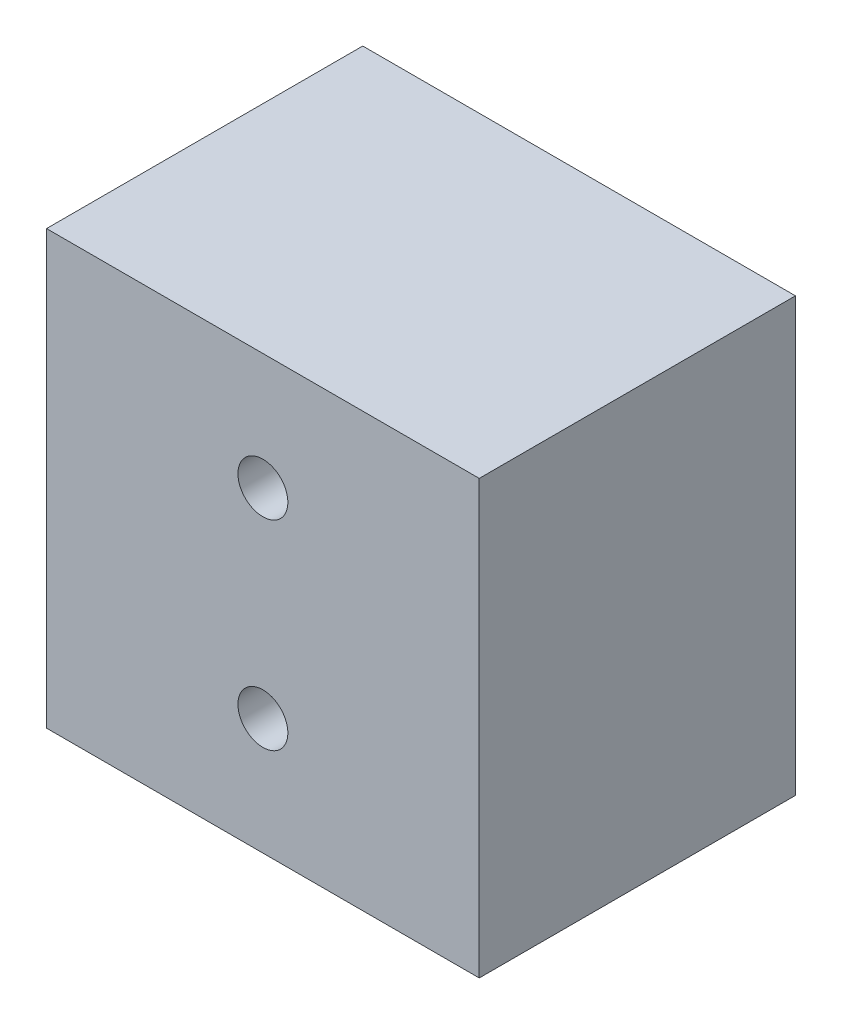
ISO-10303-21;
HEADER;
FILE_DESCRIPTION(('STEP AP214'),'2;1');
FILE_NAME('part.step','',(''),(''),'','','');
FILE_SCHEMA(('AUTOMOTIVE_DESIGN { 1 0 10303 214 1 1 1 1 }'));
ENDSEC;
DATA;
#1=APPLICATION_CONTEXT('core data for automotive mechanical design processes');
#2=APPLICATION_PROTOCOL_DEFINITION('international standard','automotive_design',2000,#1);
#3=PRODUCT_CONTEXT('',#1,'mechanical');
#4=PRODUCT('Part','Part','',(#3));
#5=PRODUCT_RELATED_PRODUCT_CATEGORY('part','',(#4));
#6=PRODUCT_DEFINITION_FORMATION('','',#4);
#7=PRODUCT_DEFINITION_CONTEXT('part definition',#1,'design');
#8=PRODUCT_DEFINITION('design','',#6,#7);
#9=PRODUCT_DEFINITION_SHAPE('','',#8);
#10=(LENGTH_UNIT() NAMED_UNIT(*) SI_UNIT(.MILLI.,.METRE.));
#11=(NAMED_UNIT(*) PLANE_ANGLE_UNIT() SI_UNIT($,.RADIAN.));
#12=(NAMED_UNIT(*) SI_UNIT($,.STERADIAN.) SOLID_ANGLE_UNIT());
#13=UNCERTAINTY_MEASURE_WITH_UNIT(LENGTH_MEASURE(1.E-05),#10,'distance_accuracy_value','');
#14=(GEOMETRIC_REPRESENTATION_CONTEXT(3) GLOBAL_UNCERTAINTY_ASSIGNED_CONTEXT((#13)) GLOBAL_UNIT_ASSIGNED_CONTEXT((#10,
#11,#12)) REPRESENTATION_CONTEXT('',''));
#15=CARTESIAN_POINT('',(0.,0.,0.));
#16=DIRECTION('',(0.,0.,1.));
#17=DIRECTION('',(1.,0.,0.));
#18=AXIS2_PLACEMENT_3D('',#15,#16,#17);
#19=CARTESIAN_POINT('',(2.65397923875433,2.85121107266436,20.));
#20=DIRECTION('',(0.,0.,-1.));
#21=DIRECTION('',(-1.,0.,0.));
#22=AXIS2_PLACEMENT_3D('',#19,#20,#21);
#23=CYLINDRICAL_SURFACE('',#22,1.5);
#24=CARTESIAN_POINT('',(2.65397923875433,2.85121107266436,20.));
#25=DIRECTION('',(0.,0.,1.));
#26=DIRECTION('',(1.,0.,0.));
#27=AXIS2_PLACEMENT_3D('',#24,#25,#26);
#28=CIRCLE('',#27,1.5);
#29=CARTESIAN_POINT('',(4.15397923875433,2.85121107266436,20.));
#30=VERTEX_POINT('',#29);
#31=EDGE_CURVE('E278',#30,#30,#28,.T.);
#32=ORIENTED_EDGE('',*,*,#31,.T.);
#33=EDGE_LOOP('',(#32));
#34=FACE_BOUND('',#33,.T.);
#35=CARTESIAN_POINT('',(2.65397923875433,2.85121107266436,17.));
#36=DIRECTION('',(0.,0.,-1.));
#37=DIRECTION('',(-1.,0.,0.));
#38=AXIS2_PLACEMENT_3D('',#35,#36,#37);
#39=CIRCLE('',#38,1.5);
#40=CARTESIAN_POINT('',(1.15397923875433,2.85121107266436,17.));
#41=VERTEX_POINT('',#40);
#42=EDGE_CURVE('E250',#41,#41,#39,.T.);
#43=ORIENTED_EDGE('',*,*,#42,.T.);
#44=EDGE_LOOP('',(#43));
#45=FACE_BOUND('',#44,.T.);
#46=ADVANCED_FACE('F55',(#34,#45),#23,.F.);
#47=CARTESIAN_POINT('',(2.65397923875433,-9.14878892733564,20.));
#48=DIRECTION('',(0.,0.,-1.));
#49=DIRECTION('',(-1.,0.,0.));
#50=AXIS2_PLACEMENT_3D('',#47,#48,#49);
#51=CYLINDRICAL_SURFACE('',#50,1.5);
#52=CARTESIAN_POINT('',(2.65397923875433,-9.14878892733564,20.));
#53=DIRECTION('',(0.,0.,1.));
#54=DIRECTION('',(1.,0.,0.));
#55=AXIS2_PLACEMENT_3D('',#52,#53,#54);
#56=CIRCLE('',#55,1.5);
#57=CARTESIAN_POINT('',(4.15397923875433,-9.14878892733564,20.));
#58=VERTEX_POINT('',#57);
#59=EDGE_CURVE('E273',#58,#58,#56,.T.);
#60=ORIENTED_EDGE('',*,*,#59,.T.);
#61=EDGE_LOOP('',(#60));
#62=FACE_BOUND('',#61,.T.);
#63=CARTESIAN_POINT('',(2.65397923875433,-9.14878892733564,17.));
#64=DIRECTION('',(0.,0.,-1.));
#65=DIRECTION('',(-1.,0.,0.));
#66=AXIS2_PLACEMENT_3D('',#63,#64,#65);
#67=CIRCLE('',#66,1.5);
#68=CARTESIAN_POINT('',(1.15397923875433,-9.14878892733564,17.));
#69=VERTEX_POINT('',#68);
#70=EDGE_CURVE('E258',#69,#69,#67,.T.);
#71=ORIENTED_EDGE('',*,*,#70,.T.);
#72=EDGE_LOOP('',(#71));
#73=FACE_BOUND('',#72,.T.);
#74=ADVANCED_FACE('F371',(#62,#73),#51,.F.);
#75=CARTESIAN_POINT('',(0.,0.,20.));
#76=DIRECTION('',(0.,0.,1.));
#77=DIRECTION('',(1.,0.,0.));
#78=AXIS2_PLACEMENT_3D('',#75,#76,#77);
#79=PLANE('',#78);
#80=ORIENTED_EDGE('',*,*,#31,.F.);
#81=EDGE_LOOP('',(#80));
#82=FACE_BOUND('',#81,.T.);
#83=DIRECTION('',(0.,-1.,0.));
#84=VECTOR('',#83,1.);
#85=CARTESIAN_POINT('',(-10.3460207612457,9.85121107266436,20.));
#86=LINE('',#85,#84);
#87=CARTESIAN_POINT('',(-10.3460207612457,9.85121107266436,20.));
#88=VERTEX_POINT('',#87);
#89=CARTESIAN_POINT('',(-10.3460207612457,-16.1487889273356,20.));
#90=VERTEX_POINT('',#89);
#91=EDGE_CURVE('E281',#88,#90,#86,.T.);
#92=ORIENTED_EDGE('',*,*,#91,.T.);
#93=DIRECTION('',(1.,0.,0.));
#94=VECTOR('',#93,1.);
#95=CARTESIAN_POINT('',(-10.3460207612457,-16.1487889273356,20.));
#96=LINE('',#95,#94);
#97=CARTESIAN_POINT('',(15.6539792387543,-16.1487889273356,20.));
#98=VERTEX_POINT('',#97);
#99=EDGE_CURVE('E284',#90,#98,#96,.T.);
#100=ORIENTED_EDGE('',*,*,#99,.T.);
#101=DIRECTION('',(0.,1.,0.));
#102=VECTOR('',#101,1.);
#103=CARTESIAN_POINT('',(15.6539792387543,9.85121107266436,20.));
#104=LINE('',#103,#102);
#105=CARTESIAN_POINT('',(15.6539792387543,9.85121107266436,20.));
#106=VERTEX_POINT('',#105);
#107=EDGE_CURVE('E286',#98,#106,#104,.T.);
#108=ORIENTED_EDGE('',*,*,#107,.T.);
#109=DIRECTION('',(-1.,0.,0.));
#110=VECTOR('',#109,1.);
#111=CARTESIAN_POINT('',(-10.3460207612457,9.85121107266436,20.));
#112=LINE('',#111,#110);
#113=EDGE_CURVE('E288',#106,#88,#112,.T.);
#114=ORIENTED_EDGE('',*,*,#113,.T.);
#115=EDGE_LOOP('',(#92,#100,#108,#114));
#116=FACE_BOUND('',#115,.T.);
#117=ORIENTED_EDGE('',*,*,#59,.F.);
#118=EDGE_LOOP('',(#117));
#119=FACE_BOUND('',#118,.T.);
#120=ADVANCED_FACE('F377',(#82,#116,#119),#79,.T.);
#121=CARTESIAN_POINT('',(0.,0.,0.));
#122=DIRECTION('',(0.,0.,1.));
#123=DIRECTION('',(1.,0.,0.));
#124=AXIS2_PLACEMENT_3D('',#121,#122,#123);
#125=PLANE('',#124);
#126=DIRECTION('',(0.75981782301125,0.650136044097268,0.));
#127=VECTOR('',#126,1.);
#128=CARTESIAN_POINT('',(2.4938976397023,-2.91463285663946,0.));
#129=LINE('',#128,#127);
#130=CARTESIAN_POINT('',(9.95166946847487,3.46658923067983,0.));
#131=VERTEX_POINT('',#130);
#132=CARTESIAN_POINT('',(10.0658035122255,3.56424771334973,0.));
#133=VERTEX_POINT('',#132);
#134=EDGE_CURVE('E205',#131,#133,#129,.T.);
#135=ORIENTED_EDGE('',*,*,#134,.T.);
#136=CARTESIAN_POINT('',(2.65397923875433,-3.14878892733564,0.));
#137=DIRECTION('',(0.,0.,-1.));
#138=DIRECTION('',(-1.,0.,0.));
#139=AXIS2_PLACEMENT_3D('',#136,#137,#138);
#140=CIRCLE('',#139,10.);
#141=CARTESIAN_POINT('',(-4.93633669586757,3.36174899303814,0.));
#142=VERTEX_POINT('',#141);
#143=EDGE_CURVE('E274',#142,#133,#140,.T.);
#144=ORIENTED_EDGE('',*,*,#143,.F.);
#145=DIRECTION('',(-0.715499346704389,0.698613401578865,0.));
#146=VECTOR('',#145,1.);
#147=CARTESIAN_POINT('',(-0.728836648382777,-0.746453109249757,0.));
#148=LINE('',#147,#146);
#149=CARTESIAN_POINT('',(-1.49333201993824,0.,0.));
#150=VERTEX_POINT('',#149);
#151=EDGE_CURVE('E236',#150,#142,#148,.T.);
#152=ORIENTED_EDGE('',*,*,#151,.F.);
#153=CARTESIAN_POINT('',(2.45397923875435,-2.94878892733563,0.));
#154=DIRECTION('',(0.,0.,-1.));
#155=DIRECTION('',(-1.,0.,0.));
#156=AXIS2_PLACEMENT_3D('',#153,#154,#155);
#157=CIRCLE('',#156,4.9271312455605);
#158=CARTESIAN_POINT('',(-1.49333201993824,-5.89757785467127,0.));
#159=VERTEX_POINT('',#158);
#160=EDGE_CURVE('E239',#159,#150,#157,.T.);
#161=ORIENTED_EDGE('',*,*,#160,.F.);
#162=DIRECTION('',(-0.715499346704389,-0.698613401578865,0.));
#163=VECTOR('',#162,1.);
#164=CARTESIAN_POINT('',(2.21911147560103,-2.2727488586225,0.));
#165=LINE('',#164,#163);
#166=CARTESIAN_POINT('',(-5.04371099096616,-9.36416708535109,0.));
#167=VERTEX_POINT('',#166);
#168=EDGE_CURVE('E225',#159,#167,#165,.T.);
#169=ORIENTED_EDGE('',*,*,#168,.T.);
#170=DIRECTION('',(-0.759817823011251,-0.650136044097267,0.));
#171=VECTOR('',#170,1.);
#172=CARTESIAN_POINT('',(2.4938976397023,-2.91463285663947,0.));
#173=LINE('',#172,#171);
#174=CARTESIAN_POINT('',(-5.12450976652541,-9.43330233687995,0.));
#175=VERTEX_POINT('',#174);
#176=EDGE_CURVE('E217',#167,#175,#173,.T.);
#177=ORIENTED_EDGE('',*,*,#176,.T.);
#178=CARTESIAN_POINT('',(10.3409786273931,-9.54488464261912,0.));
#179=VERTEX_POINT('',#178);
#180=EDGE_CURVE('E269',#179,#175,#140,.T.);
#181=ORIENTED_EDGE('',*,*,#180,.F.);
#182=DIRECTION('',(0.767091409739792,-0.641537815801547,0.));
#183=VECTOR('',#182,1.);
#184=CARTESIAN_POINT('',(-0.441166421703492,-0.527505883548846,0.));
#185=LINE('',#184,#183);
#186=CARTESIAN_POINT('',(10.1248933361523,-9.3641670853511,0.));
#187=VERTEX_POINT('',#186);
#188=EDGE_CURVE('E208',#187,#179,#185,.T.);
#189=ORIENTED_EDGE('',*,*,#188,.F.);
#190=DIRECTION('',(0.731914894905904,-0.681396057087858,0.));
#191=VECTOR('',#190,1.);
#192=CARTESIAN_POINT('',(0.0308597661532652,0.0331477152911902,0.));
#193=LINE('',#192,#191);
#194=CARTESIAN_POINT('',(6.40129049744694,-5.89757785467127,0.));
#195=VERTEX_POINT('',#194);
#196=EDGE_CURVE('E188',#195,#187,#193,.T.);
#197=ORIENTED_EDGE('',*,*,#196,.F.);
#198=CARTESIAN_POINT('',(2.45397923875435,-2.94878892733563,0.));
#199=DIRECTION('',(0.,0.,-1.));
#200=DIRECTION('',(-1.,0.,0.));
#201=AXIS2_PLACEMENT_3D('',#198,#199,#200);
#202=CIRCLE('',#201,4.9271312455605);
#203=CARTESIAN_POINT('',(6.40129049744695,0.,0.));
#204=VERTEX_POINT('',#203);
#205=EDGE_CURVE('E211',#204,#195,#202,.T.);
#206=ORIENTED_EDGE('',*,*,#205,.F.);
#207=DIRECTION('',(0.715499346704389,0.698613401578865,0.));
#208=VECTOR('',#207,1.);
#209=CARTESIAN_POINT('',(3.12421822420756,-3.19973263228348,0.));
#210=LINE('',#209,#208);
#211=EDGE_CURVE('E199',#204,#131,#210,.T.);
#212=ORIENTED_EDGE('',*,*,#211,.T.);
#213=EDGE_LOOP('',(#135,#144,#152,#161,#169,#177,#181,#189,#197,#206,#212));
#214=FACE_BOUND('',#213,.T.);
#215=DIRECTION('',(0.,-1.,0.));
#216=VECTOR('',#215,1.);
#217=CARTESIAN_POINT('',(14.6539792387543,0.,0.));
#218=LINE('',#217,#216);
#219=CARTESIAN_POINT('',(14.6539792387543,8.85121107266436,0.));
#220=VERTEX_POINT('',#219);
#221=CARTESIAN_POINT('',(14.6539792387543,-15.1487889273356,0.));
#222=VERTEX_POINT('',#221);
#223=EDGE_CURVE('E307',#220,#222,#218,.T.);
#224=ORIENTED_EDGE('',*,*,#223,.T.);
#225=DIRECTION('',(-1.,0.,0.));
#226=VECTOR('',#225,1.);
#227=CARTESIAN_POINT('',(0.,-15.1487889273356,0.));
#228=LINE('',#227,#226);
#229=CARTESIAN_POINT('',(-9.34602076124567,-15.1487889273356,0.));
#230=VERTEX_POINT('',#229);
#231=EDGE_CURVE('E311',#222,#230,#228,.T.);
#232=ORIENTED_EDGE('',*,*,#231,.T.);
#233=DIRECTION('',(0.,1.,0.));
#234=VECTOR('',#233,1.);
#235=CARTESIAN_POINT('',(-9.34602076124567,0.,0.));
#236=LINE('',#235,#234);
#237=CARTESIAN_POINT('',(-9.34602076124567,8.85121107266436,0.));
#238=VERTEX_POINT('',#237);
#239=EDGE_CURVE('E309',#230,#238,#236,.T.);
#240=ORIENTED_EDGE('',*,*,#239,.T.);
#241=DIRECTION('',(1.,0.,0.));
#242=VECTOR('',#241,1.);
#243=CARTESIAN_POINT('',(0.,8.85121107266436,0.));
#244=LINE('',#243,#242);
#245=EDGE_CURVE('E305',#238,#220,#244,.T.);
#246=ORIENTED_EDGE('',*,*,#245,.T.);
#247=EDGE_LOOP('',(#224,#232,#240,#246));
#248=FACE_BOUND('',#247,.T.);
#249=ADVANCED_FACE('F347',(#214,#248),#125,.F.);
#250=CARTESIAN_POINT('',(-10.3460207612457,9.85121107266436,20.));
#251=DIRECTION('',(1.,0.,0.));
#252=DIRECTION('',(0.,0.,-1.));
#253=AXIS2_PLACEMENT_3D('',#250,#251,#252);
#254=PLANE('',#253);
#255=DIRECTION('',(0.,0.,-1.));
#256=VECTOR('',#255,1.);
#257=CARTESIAN_POINT('',(-10.3460207612457,9.85121107266436,20.));
#258=LINE('',#257,#256);
#259=CARTESIAN_POINT('',(-10.3460207612457,9.85121107266436,0.999999999999994));
#260=VERTEX_POINT('',#259);
#261=EDGE_CURVE('E290',#88,#260,#258,.T.);
#262=ORIENTED_EDGE('',*,*,#261,.T.);
#263=DIRECTION('',(0.,-1.,0.));
#264=VECTOR('',#263,1.);
#265=CARTESIAN_POINT('',(-10.3460207612457,9.85121107266436,0.999999999999994));
#266=LINE('',#265,#264);
#267=CARTESIAN_POINT('',(-10.3460207612457,-16.1487889273356,0.999999999999994));
#268=VERTEX_POINT('',#267);
#269=EDGE_CURVE('E314',#260,#268,#266,.T.);
#270=ORIENTED_EDGE('',*,*,#269,.T.);
#271=DIRECTION('',(0.,0.,-1.));
#272=VECTOR('',#271,1.);
#273=CARTESIAN_POINT('',(-10.3460207612457,-16.1487889273356,20.));
#274=LINE('',#273,#272);
#275=EDGE_CURVE('E299',#90,#268,#274,.T.);
#276=ORIENTED_EDGE('',*,*,#275,.F.);
#277=ORIENTED_EDGE('',*,*,#91,.F.);
#278=EDGE_LOOP('',(#262,#270,#276,#277));
#279=FACE_BOUND('',#278,.T.);
#280=ADVANCED_FACE('F385',(#279),#254,.F.);
#281=CARTESIAN_POINT('',(-10.3460207612457,-16.1487889273356,20.));
#282=DIRECTION('',(0.,1.,0.));
#283=DIRECTION('',(0.,0.,1.));
#284=AXIS2_PLACEMENT_3D('',#281,#282,#283);
#285=PLANE('',#284);
#286=ORIENTED_EDGE('',*,*,#275,.T.);
#287=DIRECTION('',(1.,0.,0.));
#288=VECTOR('',#287,1.);
#289=CARTESIAN_POINT('',(-10.3460207612457,-16.1487889273356,0.999999999999994));
#290=LINE('',#289,#288);
#291=CARTESIAN_POINT('',(15.6539792387543,-16.1487889273356,0.999999999999994));
#292=VERTEX_POINT('',#291);
#293=EDGE_CURVE('E302',#268,#292,#290,.T.);
#294=ORIENTED_EDGE('',*,*,#293,.T.);
#295=DIRECTION('',(0.,0.,-1.));
#296=VECTOR('',#295,1.);
#297=CARTESIAN_POINT('',(15.6539792387543,-16.1487889273356,20.));
#298=LINE('',#297,#296);
#299=EDGE_CURVE('E296',#98,#292,#298,.T.);
#300=ORIENTED_EDGE('',*,*,#299,.F.);
#301=ORIENTED_EDGE('',*,*,#99,.F.);
#302=EDGE_LOOP('',(#286,#294,#300,#301));
#303=FACE_BOUND('',#302,.T.);
#304=ADVANCED_FACE('F389',(#303),#285,.F.);
#305=CARTESIAN_POINT('',(15.6539792387543,9.85121107266436,20.));
#306=DIRECTION('',(-1.,0.,0.));
#307=DIRECTION('',(0.,-1.,0.));
#308=AXIS2_PLACEMENT_3D('',#305,#306,#307);
#309=PLANE('',#308);
#310=ORIENTED_EDGE('',*,*,#299,.T.);
#311=DIRECTION('',(0.,1.,0.));
#312=VECTOR('',#311,1.);
#313=CARTESIAN_POINT('',(15.6539792387543,9.85121107266436,0.999999999999994));
#314=LINE('',#313,#312);
#315=CARTESIAN_POINT('',(15.6539792387543,9.85121107266436,0.999999999999994));
#316=VERTEX_POINT('',#315);
#317=EDGE_CURVE('E316',#292,#316,#314,.T.);
#318=ORIENTED_EDGE('',*,*,#317,.T.);
#319=DIRECTION('',(0.,0.,-1.));
#320=VECTOR('',#319,1.);
#321=CARTESIAN_POINT('',(15.6539792387543,9.85121107266436,20.));
#322=LINE('',#321,#320);
#323=EDGE_CURVE('E293',#106,#316,#322,.T.);
#324=ORIENTED_EDGE('',*,*,#323,.F.);
#325=ORIENTED_EDGE('',*,*,#107,.F.);
#326=EDGE_LOOP('',(#310,#318,#324,#325));
#327=FACE_BOUND('',#326,.T.);
#328=ADVANCED_FACE('F365',(#327),#309,.F.);
#329=CARTESIAN_POINT('',(-10.3460207612457,9.85121107266436,20.));
#330=DIRECTION('',(0.,-1.,0.));
#331=DIRECTION('',(0.,0.,-1.));
#332=AXIS2_PLACEMENT_3D('',#329,#330,#331);
#333=PLANE('',#332);
#334=ORIENTED_EDGE('',*,*,#323,.T.);
#335=DIRECTION('',(-1.,0.,0.));
#336=VECTOR('',#335,1.);
#337=CARTESIAN_POINT('',(-10.3460207612457,9.85121107266436,0.999999999999994));
#338=LINE('',#337,#336);
#339=EDGE_CURVE('E318',#316,#260,#338,.T.);
#340=ORIENTED_EDGE('',*,*,#339,.T.);
#341=ORIENTED_EDGE('',*,*,#261,.F.);
#342=ORIENTED_EDGE('',*,*,#113,.F.);
#343=EDGE_LOOP('',(#334,#340,#341,#342));
#344=FACE_BOUND('',#343,.T.);
#345=ADVANCED_FACE('F355',(#344),#333,.F.);
#346=CARTESIAN_POINT('',(2.65397923875433,-3.14878892733564,15.));
#347=DIRECTION('',(0.,0.,-1.));
#348=DIRECTION('',(-1.,0.,0.));
#349=AXIS2_PLACEMENT_3D('',#346,#347,#348);
#350=CYLINDRICAL_SURFACE('',#349,10.);
#351=CARTESIAN_POINT('',(2.65397923875433,-3.14878892733564,15.));
#352=DIRECTION('',(0.,0.,-1.));
#353=DIRECTION('',(-1.,0.,0.));
#354=AXIS2_PLACEMENT_3D('',#351,#352,#353);
#355=CIRCLE('',#354,10.);
#356=CARTESIAN_POINT('',(-7.34602076124567,-3.14878892733564,15.));
#357=VERTEX_POINT('',#356);
#358=EDGE_CURVE('E270',#357,#357,#355,.T.);
#359=ORIENTED_EDGE('',*,*,#358,.F.);
#360=EDGE_LOOP('',(#359));
#361=FACE_BOUND('',#360,.T.);
#362=ORIENTED_EDGE('',*,*,#143,.T.);
#363=DIRECTION('',(0.,0.,-1.));
#364=VECTOR('',#363,1.);
#365=CARTESIAN_POINT('',(10.0658035122255,3.56424771334973,15.));
#366=LINE('',#365,#364);
#367=CARTESIAN_POINT('',(10.0658035122255,3.56424771334973,3.5));
#368=VERTEX_POINT('',#367);
#369=EDGE_CURVE('E12',#133,#368,#366,.F.);
#370=ORIENTED_EDGE('',*,*,#369,.T.);
#371=CARTESIAN_POINT('',(2.65397923875433,-3.14878892733564,3.5));
#372=DIRECTION('',(0.,0.,-1.));
#373=DIRECTION('',(-1.,0.,0.));
#374=AXIS2_PLACEMENT_3D('',#371,#372,#373);
#375=CIRCLE('',#374,10.);
#376=CARTESIAN_POINT('',(10.3409786273931,-9.54488464261912,3.5));
#377=VERTEX_POINT('',#376);
#378=EDGE_CURVE('E73',#377,#368,#375,.F.);
#379=ORIENTED_EDGE('',*,*,#378,.F.);
#380=DIRECTION('',(0.,0.,-1.));
#381=VECTOR('',#380,1.);
#382=CARTESIAN_POINT('',(10.3409786273931,-9.54488464261912,15.));
#383=LINE('',#382,#381);
#384=EDGE_CURVE('E64',#179,#377,#383,.F.);
#385=ORIENTED_EDGE('',*,*,#384,.F.);
#386=ORIENTED_EDGE('',*,*,#180,.T.);
#387=DIRECTION('',(0.,0.,-1.));
#388=VECTOR('',#387,1.);
#389=CARTESIAN_POINT('',(-5.1245097665254,-9.43330233687995,15.));
#390=LINE('',#389,#388);
#391=CARTESIAN_POINT('',(-5.12450976652541,-9.43330233687995,3.5));
#392=VERTEX_POINT('',#391);
#393=EDGE_CURVE('E334',#175,#392,#390,.F.);
#394=ORIENTED_EDGE('',*,*,#393,.T.);
#395=CARTESIAN_POINT('',(2.65397923875433,-3.14878892733564,3.5));
#396=DIRECTION('',(0.,0.,-1.));
#397=DIRECTION('',(-1.,0.,0.));
#398=AXIS2_PLACEMENT_3D('',#395,#396,#397);
#399=CIRCLE('',#398,10.);
#400=CARTESIAN_POINT('',(-4.93633669586757,3.36174899303814,3.5));
#401=VERTEX_POINT('',#400);
#402=EDGE_CURVE('E320',#401,#392,#399,.F.);
#403=ORIENTED_EDGE('',*,*,#402,.F.);
#404=DIRECTION('',(0.,0.,-1.));
#405=VECTOR('',#404,1.);
#406=CARTESIAN_POINT('',(-4.93633669586756,3.36174899303814,15.));
#407=LINE('',#406,#405);
#408=EDGE_CURVE('E331',#142,#401,#407,.F.);
#409=ORIENTED_EDGE('',*,*,#408,.F.);
#410=EDGE_LOOP('',(#362,#370,#379,#385,#386,#394,#403,#409));
#411=FACE_BOUND('',#410,.T.);
#412=ADVANCED_FACE('F351',(#361,#411),#350,.F.);
#413=CARTESIAN_POINT('',(2.65397923875433,-3.14878892733564,15.));
#414=DIRECTION('',(0.,0.,-1.));
#415=DIRECTION('',(-1.,0.,0.));
#416=AXIS2_PLACEMENT_3D('',#413,#414,#415);
#417=PLANE('',#416);
#418=CARTESIAN_POINT('',(2.65397923875433,2.85121107266436,15.));
#419=DIRECTION('',(0.,0.,-1.));
#420=DIRECTION('',(-1.,0.,0.));
#421=AXIS2_PLACEMENT_3D('',#418,#419,#420);
#422=CIRCLE('',#421,3.);
#423=CARTESIAN_POINT('',(-0.346020761245673,2.85121107266436,15.));
#424=VERTEX_POINT('',#423);
#425=EDGE_CURVE('E266',#424,#424,#422,.T.);
#426=ORIENTED_EDGE('',*,*,#425,.F.);
#427=EDGE_LOOP('',(#426));
#428=FACE_BOUND('',#427,.T.);
#429=CARTESIAN_POINT('',(2.65397923875433,-9.14878892733564,15.));
#430=DIRECTION('',(0.,0.,-1.));
#431=DIRECTION('',(-1.,0.,0.));
#432=AXIS2_PLACEMENT_3D('',#429,#430,#431);
#433=CIRCLE('',#432,3.);
#434=CARTESIAN_POINT('',(-0.34602076124567,-9.14878892733564,15.));
#435=VERTEX_POINT('',#434);
#436=EDGE_CURVE('E257',#435,#435,#433,.T.);
#437=ORIENTED_EDGE('',*,*,#436,.F.);
#438=EDGE_LOOP('',(#437));
#439=FACE_BOUND('',#438,.T.);
#440=ORIENTED_EDGE('',*,*,#358,.T.);
#441=EDGE_LOOP('',(#440));
#442=FACE_BOUND('',#441,.T.);
#443=ADVANCED_FACE('F354',(#428,#439,#442),#417,.T.);
#444=CARTESIAN_POINT('',(2.65397923875433,-9.14878892733564,17.));
#445=DIRECTION('',(0.,0.,-1.));
#446=DIRECTION('',(-1.,0.,0.));
#447=AXIS2_PLACEMENT_3D('',#444,#445,#446);
#448=CYLINDRICAL_SURFACE('',#447,3.);
#449=ORIENTED_EDGE('',*,*,#436,.T.);
#450=EDGE_LOOP('',(#449));
#451=FACE_BOUND('',#450,.T.);
#452=CARTESIAN_POINT('',(2.65397923875433,-9.14878892733564,17.));
#453=DIRECTION('',(0.,0.,-1.));
#454=DIRECTION('',(-1.,0.,0.));
#455=AXIS2_PLACEMENT_3D('',#452,#453,#454);
#456=CIRCLE('',#455,3.);
#457=CARTESIAN_POINT('',(-0.34602076124567,-9.14878892733564,17.));
#458=VERTEX_POINT('',#457);
#459=EDGE_CURVE('E254',#458,#458,#456,.T.);
#460=ORIENTED_EDGE('',*,*,#459,.F.);
#461=EDGE_LOOP('',(#460));
#462=FACE_BOUND('',#461,.T.);
#463=ADVANCED_FACE('F362',(#451,#462),#448,.F.);
#464=CARTESIAN_POINT('',(0.,0.,17.));
#465=DIRECTION('',(0.,0.,-1.));
#466=DIRECTION('',(-1.,0.,0.));
#467=AXIS2_PLACEMENT_3D('',#464,#465,#466);
#468=PLANE('',#467);
#469=ORIENTED_EDGE('',*,*,#70,.F.);
#470=EDGE_LOOP('',(#469));
#471=FACE_BOUND('',#470,.T.);
#472=ORIENTED_EDGE('',*,*,#459,.T.);
#473=EDGE_LOOP('',(#472));
#474=FACE_BOUND('',#473,.T.);
#475=ADVANCED_FACE('F447',(#471,#474),#468,.T.);
#476=CARTESIAN_POINT('',(2.65397923875433,2.85121107266436,17.));
#477=DIRECTION('',(0.,0.,-1.));
#478=DIRECTION('',(-1.,0.,0.));
#479=AXIS2_PLACEMENT_3D('',#476,#477,#478);
#480=CYLINDRICAL_SURFACE('',#479,3.);
#481=ORIENTED_EDGE('',*,*,#425,.T.);
#482=EDGE_LOOP('',(#481));
#483=FACE_BOUND('',#482,.T.);
#484=CARTESIAN_POINT('',(2.65397923875433,2.85121107266436,17.));
#485=DIRECTION('',(0.,0.,-1.));
#486=DIRECTION('',(-1.,0.,0.));
#487=AXIS2_PLACEMENT_3D('',#484,#485,#486);
#488=CIRCLE('',#487,3.);
#489=CARTESIAN_POINT('',(-0.346020761245673,2.85121107266436,17.));
#490=VERTEX_POINT('',#489);
#491=EDGE_CURVE('E253',#490,#490,#488,.T.);
#492=ORIENTED_EDGE('',*,*,#491,.F.);
#493=EDGE_LOOP('',(#492));
#494=FACE_BOUND('',#493,.T.);
#495=ADVANCED_FACE('F450',(#483,#494),#480,.F.);
#496=CARTESIAN_POINT('',(0.,0.,17.));
#497=DIRECTION('',(0.,0.,-1.));
#498=DIRECTION('',(-1.,0.,0.));
#499=AXIS2_PLACEMENT_3D('',#496,#497,#498);
#500=PLANE('',#499);
#501=ORIENTED_EDGE('',*,*,#42,.F.);
#502=EDGE_LOOP('',(#501));
#503=FACE_BOUND('',#502,.T.);
#504=ORIENTED_EDGE('',*,*,#491,.T.);
#505=EDGE_LOOP('',(#504));
#506=FACE_BOUND('',#505,.T.);
#507=ADVANCED_FACE('F420',(#503,#506),#500,.T.);
#508=CARTESIAN_POINT('',(-10.3460207612457,9.85121107266436,0.999999999999994));
#509=DIRECTION('',(0.,-0.707106781186546,0.707106781186549));
#510=DIRECTION('',(-1.,0.,0.));
#511=AXIS2_PLACEMENT_3D('',#508,#509,#510);
#512=PLANE('',#511);
#513=DIRECTION('',(-0.577350269189626,-0.577350269189627,-0.577350269189625));
#514=VECTOR('',#513,1.);
#515=CARTESIAN_POINT('',(6.98731257208765,1.18454440599768,-7.66666666666666));
#516=LINE('',#515,#514);
#517=EDGE_CURVE('E324',#220,#316,#516,.F.);
#518=ORIENTED_EDGE('',*,*,#517,.F.);
#519=ORIENTED_EDGE('',*,*,#245,.F.);
#520=DIRECTION('',(-0.577350269189626,0.577350269189626,0.577350269189624));
#521=VECTOR('',#520,1.);
#522=CARTESIAN_POINT('',(-10.3460207612457,9.85121107266436,0.999999999999994));
#523=LINE('',#522,#521);
#524=EDGE_CURVE('E261',#260,#238,#523,.F.);
#525=ORIENTED_EDGE('',*,*,#524,.F.);
#526=ORIENTED_EDGE('',*,*,#339,.F.);
#527=EDGE_LOOP('',(#518,#519,#525,#526));
#528=FACE_BOUND('',#527,.T.);
#529=ADVANCED_FACE('F58',(#528),#512,.F.);
#530=CARTESIAN_POINT('',(-10.3460207612457,9.85121107266436,0.999999999999994));
#531=DIRECTION('',(0.707106781186546,0.,0.707106781186549));
#532=DIRECTION('',(0.,-1.,0.));
#533=AXIS2_PLACEMENT_3D('',#530,#531,#532);
#534=PLANE('',#533);
#535=ORIENTED_EDGE('',*,*,#524,.T.);
#536=ORIENTED_EDGE('',*,*,#239,.F.);
#537=DIRECTION('',(-0.577350269189626,-0.577350269189626,0.577350269189624));
#538=VECTOR('',#537,1.);
#539=CARTESIAN_POINT('',(-1.67935409457898,-7.48212226066896,-7.66666666666666));
#540=LINE('',#539,#538);
#541=EDGE_CURVE('E322',#268,#230,#540,.F.);
#542=ORIENTED_EDGE('',*,*,#541,.F.);
#543=ORIENTED_EDGE('',*,*,#269,.F.);
#544=EDGE_LOOP('',(#535,#536,#542,#543));
#545=FACE_BOUND('',#544,.T.);
#546=ADVANCED_FACE('F411',(#545),#534,.F.);
#547=CARTESIAN_POINT('',(15.6539792387543,9.85121107266436,0.999999999999994));
#548=DIRECTION('',(-0.707106781186546,0.,0.707106781186549));
#549=DIRECTION('',(0.,1.,0.));
#550=AXIS2_PLACEMENT_3D('',#547,#548,#549);
#551=PLANE('',#550);
#552=ORIENTED_EDGE('',*,*,#517,.T.);
#553=ORIENTED_EDGE('',*,*,#317,.F.);
#554=DIRECTION('',(-0.577350269189626,0.577350269189627,-0.577350269189625));
#555=VECTOR('',#554,1.);
#556=CARTESIAN_POINT('',(6.98731257208765,-7.48212226066895,-7.66666666666667));
#557=LINE('',#556,#555);
#558=EDGE_CURVE('E245',#222,#292,#557,.F.);
#559=ORIENTED_EDGE('',*,*,#558,.F.);
#560=ORIENTED_EDGE('',*,*,#223,.F.);
#561=EDGE_LOOP('',(#552,#553,#559,#560));
#562=FACE_BOUND('',#561,.T.);
#563=ADVANCED_FACE('F405',(#562),#551,.F.);
#564=CARTESIAN_POINT('',(-10.3460207612457,-16.1487889273356,0.999999999999994));
#565=DIRECTION('',(0.,0.707106781186546,0.707106781186549));
#566=DIRECTION('',(1.,0.,0.));
#567=AXIS2_PLACEMENT_3D('',#564,#565,#566);
#568=PLANE('',#567);
#569=ORIENTED_EDGE('',*,*,#541,.T.);
#570=ORIENTED_EDGE('',*,*,#231,.F.);
#571=ORIENTED_EDGE('',*,*,#558,.T.);
#572=ORIENTED_EDGE('',*,*,#293,.F.);
#573=EDGE_LOOP('',(#569,#570,#571,#572));
#574=FACE_BOUND('',#573,.T.);
#575=ADVANCED_FACE('F398',(#574),#568,.F.);
#576=CARTESIAN_POINT('',(2.4938976397023,-2.91463285663947,3.5));
#577=DIRECTION('',(0.650136044097267,-0.759817823011251,0.));
#578=DIRECTION('',(0.759817823011251,0.650136044097267,0.));
#579=AXIS2_PLACEMENT_3D('',#576,#577,#578);
#580=PLANE('',#579);
#581=ORIENTED_EDGE('',*,*,#393,.F.);
#582=ORIENTED_EDGE('',*,*,#176,.F.);
#583=DIRECTION('',(0.,0.,-1.));
#584=VECTOR('',#583,1.);
#585=CARTESIAN_POINT('',(-5.04371099096616,-9.36416708535109,3.5));
#586=LINE('',#585,#584);
#587=CARTESIAN_POINT('',(-5.04371099096616,-9.36416708535109,3.5));
#588=VERTEX_POINT('',#587);
#589=EDGE_CURVE('E243',#588,#167,#586,.T.);
#590=ORIENTED_EDGE('',*,*,#589,.F.);
#591=DIRECTION('',(-0.759817823011251,-0.650136044097267,0.));
#592=VECTOR('',#591,1.);
#593=CARTESIAN_POINT('',(2.4938976397023,-2.91463285663947,3.5));
#594=LINE('',#593,#592);
#595=EDGE_CURVE('E221',#588,#392,#594,.T.);
#596=ORIENTED_EDGE('',*,*,#595,.T.);
#597=EDGE_LOOP('',(#581,#582,#590,#596));
#598=FACE_BOUND('',#597,.T.);
#599=ADVANCED_FACE('F404',(#598),#580,.T.);
#600=CARTESIAN_POINT('',(-0.728836648382777,-0.746453109249757,3.5));
#601=DIRECTION('',(-0.698613401578865,-0.715499346704389,0.));
#602=DIRECTION('',(0.715499346704389,-0.698613401578865,0.));
#603=AXIS2_PLACEMENT_3D('',#600,#601,#602);
#604=PLANE('',#603);
#605=ORIENTED_EDGE('',*,*,#151,.T.);
#606=ORIENTED_EDGE('',*,*,#408,.T.);
#607=DIRECTION('',(-0.715499346704389,0.698613401578865,0.));
#608=VECTOR('',#607,1.);
#609=CARTESIAN_POINT('',(-0.728836648382777,-0.746453109249757,3.5));
#610=LINE('',#609,#608);
#611=CARTESIAN_POINT('',(-1.49333201993824,0.,3.5));
#612=VERTEX_POINT('',#611);
#613=EDGE_CURVE('E224',#612,#401,#610,.T.);
#614=ORIENTED_EDGE('',*,*,#613,.F.);
#615=DIRECTION('',(0.,0.,-1.));
#616=VECTOR('',#615,1.);
#617=CARTESIAN_POINT('',(-1.49333201993824,0.,3.5));
#618=LINE('',#617,#616);
#619=EDGE_CURVE('E233',#612,#150,#618,.T.);
#620=ORIENTED_EDGE('',*,*,#619,.T.);
#621=EDGE_LOOP('',(#605,#606,#614,#620));
#622=FACE_BOUND('',#621,.T.);
#623=ADVANCED_FACE('F468',(#622),#604,.F.);
#624=CARTESIAN_POINT('',(0.,0.,3.5));
#625=DIRECTION('',(0.,0.,-1.));
#626=DIRECTION('',(-1.,0.,0.));
#627=AXIS2_PLACEMENT_3D('',#624,#625,#626);
#628=PLANE('',#627);
#629=ORIENTED_EDGE('',*,*,#613,.T.);
#630=ORIENTED_EDGE('',*,*,#402,.T.);
#631=ORIENTED_EDGE('',*,*,#595,.F.);
#632=DIRECTION('',(-0.715499346704389,-0.698613401578865,0.));
#633=VECTOR('',#632,1.);
#634=CARTESIAN_POINT('',(2.21911147560103,-2.2727488586225,3.5));
#635=LINE('',#634,#633);
#636=CARTESIAN_POINT('',(-1.49333201993824,-5.89757785467127,3.5));
#637=VERTEX_POINT('',#636);
#638=EDGE_CURVE('E230',#637,#588,#635,.T.);
#639=ORIENTED_EDGE('',*,*,#638,.F.);
#640=CARTESIAN_POINT('',(2.45397923875435,-2.94878892733563,3.5));
#641=DIRECTION('',(0.,0.,-1.));
#642=DIRECTION('',(-1.,0.,0.));
#643=AXIS2_PLACEMENT_3D('',#640,#641,#642);
#644=CIRCLE('',#643,4.9271312455605);
#645=EDGE_CURVE('E228',#637,#612,#644,.T.);
#646=ORIENTED_EDGE('',*,*,#645,.T.);
#647=EDGE_LOOP('',(#629,#630,#631,#639,#646));
#648=FACE_BOUND('',#647,.T.);
#649=ADVANCED_FACE('F472',(#648),#628,.F.);
#650=CARTESIAN_POINT('',(2.21911147560103,-2.2727488586225,3.5));
#651=DIRECTION('',(0.698613401578865,-0.715499346704389,0.));
#652=DIRECTION('',(0.715499346704389,0.698613401578865,0.));
#653=AXIS2_PLACEMENT_3D('',#650,#651,#652);
#654=PLANE('',#653);
#655=ORIENTED_EDGE('',*,*,#168,.F.);
#656=DIRECTION('',(0.,0.,-1.));
#657=VECTOR('',#656,1.);
#658=CARTESIAN_POINT('',(-1.49333201993824,-5.89757785467127,3.5));
#659=LINE('',#658,#657);
#660=EDGE_CURVE('E246',#637,#159,#659,.T.);
#661=ORIENTED_EDGE('',*,*,#660,.F.);
#662=ORIENTED_EDGE('',*,*,#638,.T.);
#663=ORIENTED_EDGE('',*,*,#589,.T.);
#664=EDGE_LOOP('',(#655,#661,#662,#663));
#665=FACE_BOUND('',#664,.T.);
#666=ADVANCED_FACE('F477',(#665),#654,.T.);
#667=CARTESIAN_POINT('',(2.45397923875435,-2.94878892733563,3.5));
#668=DIRECTION('',(0.,0.,-1.));
#669=DIRECTION('',(-1.,0.,0.));
#670=AXIS2_PLACEMENT_3D('',#667,#668,#669);
#671=CYLINDRICAL_SURFACE('',#670,4.9271312455605);
#672=ORIENTED_EDGE('',*,*,#160,.T.);
#673=ORIENTED_EDGE('',*,*,#619,.F.);
#674=ORIENTED_EDGE('',*,*,#645,.F.);
#675=ORIENTED_EDGE('',*,*,#660,.T.);
#676=EDGE_LOOP('',(#672,#673,#674,#675));
#677=FACE_BOUND('',#676,.T.);
#678=ADVANCED_FACE('F474',(#677),#671,.F.);
#679=CARTESIAN_POINT('',(2.4938976397023,-2.91463285663946,3.5));
#680=DIRECTION('',(-0.650136044097268,0.75981782301125,0.));
#681=DIRECTION('',(-0.75981782301125,-0.650136044097268,0.));
#682=AXIS2_PLACEMENT_3D('',#679,#680,#681);
#683=PLANE('',#682);
#684=ORIENTED_EDGE('',*,*,#369,.F.);
#685=ORIENTED_EDGE('',*,*,#134,.F.);
#686=DIRECTION('',(0.,0.,-1.));
#687=VECTOR('',#686,1.);
#688=CARTESIAN_POINT('',(9.95166946847487,3.46658923067983,3.5));
#689=LINE('',#688,#687);
#690=CARTESIAN_POINT('',(9.95166946847487,3.46658923067983,3.5));
#691=VERTEX_POINT('',#690);
#692=EDGE_CURVE('E215',#691,#131,#689,.T.);
#693=ORIENTED_EDGE('',*,*,#692,.F.);
#694=DIRECTION('',(0.75981782301125,0.650136044097268,0.));
#695=VECTOR('',#694,1.);
#696=CARTESIAN_POINT('',(2.4938976397023,-2.91463285663946,3.5));
#697=LINE('',#696,#695);
#698=EDGE_CURVE('E196',#691,#368,#697,.T.);
#699=ORIENTED_EDGE('',*,*,#698,.T.);
#700=EDGE_LOOP('',(#684,#685,#693,#699));
#701=FACE_BOUND('',#700,.T.);
#702=ADVANCED_FACE('F338',(#701),#683,.T.);
#703=CARTESIAN_POINT('',(-0.441166421703492,-0.527505883548846,3.5));
#704=DIRECTION('',(0.641537815801547,0.767091409739792,0.));
#705=DIRECTION('',(-0.767091409739792,0.641537815801547,0.));
#706=AXIS2_PLACEMENT_3D('',#703,#704,#705);
#707=PLANE('',#706);
#708=ORIENTED_EDGE('',*,*,#188,.T.);
#709=ORIENTED_EDGE('',*,*,#384,.T.);
#710=DIRECTION('',(0.767091409739792,-0.641537815801547,0.));
#711=VECTOR('',#710,1.);
#712=CARTESIAN_POINT('',(-0.441166421703492,-0.527505883548846,3.5));
#713=LINE('',#712,#711);
#714=CARTESIAN_POINT('',(10.1248933361523,-9.3641670853511,3.5));
#715=VERTEX_POINT('',#714);
#716=EDGE_CURVE('E176',#715,#377,#713,.T.);
#717=ORIENTED_EDGE('',*,*,#716,.F.);
#718=DIRECTION('',(0.,0.,-1.));
#719=VECTOR('',#718,1.);
#720=CARTESIAN_POINT('',(10.1248933361523,-9.3641670853511,3.5));
#721=LINE('',#720,#719);
#722=EDGE_CURVE('E185',#715,#187,#721,.T.);
#723=ORIENTED_EDGE('',*,*,#722,.T.);
#724=EDGE_LOOP('',(#708,#709,#717,#723));
#725=FACE_BOUND('',#724,.T.);
#726=ADVANCED_FACE('F195',(#725),#707,.F.);
#727=CARTESIAN_POINT('',(0.,0.,3.5));
#728=DIRECTION('',(0.,0.,-1.));
#729=DIRECTION('',(-1.,0.,0.));
#730=AXIS2_PLACEMENT_3D('',#727,#728,#729);
#731=PLANE('',#730);
#732=ORIENTED_EDGE('',*,*,#716,.T.);
#733=ORIENTED_EDGE('',*,*,#378,.T.);
#734=ORIENTED_EDGE('',*,*,#698,.F.);
#735=DIRECTION('',(0.715499346704389,0.698613401578865,0.));
#736=VECTOR('',#735,1.);
#737=CARTESIAN_POINT('',(3.12421822420756,-3.19973263228348,3.5));
#738=LINE('',#737,#736);
#739=CARTESIAN_POINT('',(6.40129049744695,0.,3.5));
#740=VERTEX_POINT('',#739);
#741=EDGE_CURVE('E193',#740,#691,#738,.T.);
#742=ORIENTED_EDGE('',*,*,#741,.F.);
#743=CARTESIAN_POINT('',(2.45397923875435,-2.94878892733563,3.5));
#744=DIRECTION('',(0.,0.,-1.));
#745=DIRECTION('',(-1.,0.,0.));
#746=AXIS2_PLACEMENT_3D('',#743,#744,#745);
#747=CIRCLE('',#746,4.9271312455605);
#748=CARTESIAN_POINT('',(6.40129049744694,-5.89757785467127,3.5));
#749=VERTEX_POINT('',#748);
#750=EDGE_CURVE('E179',#740,#749,#747,.T.);
#751=ORIENTED_EDGE('',*,*,#750,.T.);
#752=DIRECTION('',(0.731914894905904,-0.681396057087858,0.));
#753=VECTOR('',#752,1.);
#754=CARTESIAN_POINT('',(0.0308597661532652,0.0331477152911902,3.5));
#755=LINE('',#754,#753);
#756=EDGE_CURVE('E172',#749,#715,#755,.T.);
#757=ORIENTED_EDGE('',*,*,#756,.T.);
#758=EDGE_LOOP('',(#732,#733,#734,#742,#751,#757));
#759=FACE_BOUND('',#758,.T.);
#760=ADVANCED_FACE('F174',(#759),#731,.F.);
#761=CARTESIAN_POINT('',(3.12421822420756,-3.19973263228348,3.5));
#762=DIRECTION('',(-0.698613401578865,0.715499346704389,0.));
#763=DIRECTION('',(-0.715499346704389,-0.698613401578865,0.));
#764=AXIS2_PLACEMENT_3D('',#761,#762,#763);
#765=PLANE('',#764);
#766=ORIENTED_EDGE('',*,*,#211,.F.);
#767=DIRECTION('',(0.,0.,-1.));
#768=VECTOR('',#767,1.);
#769=CARTESIAN_POINT('',(6.40129049744695,0.,3.5));
#770=LINE('',#769,#768);
#771=EDGE_CURVE('E218',#740,#204,#770,.T.);
#772=ORIENTED_EDGE('',*,*,#771,.F.);
#773=ORIENTED_EDGE('',*,*,#741,.T.);
#774=ORIENTED_EDGE('',*,*,#692,.T.);
#775=EDGE_LOOP('',(#766,#772,#773,#774));
#776=FACE_BOUND('',#775,.T.);
#777=ADVANCED_FACE('F342',(#776),#765,.T.);
#778=CARTESIAN_POINT('',(2.45397923875435,-2.94878892733563,3.5));
#779=DIRECTION('',(0.,0.,-1.));
#780=DIRECTION('',(-1.,0.,0.));
#781=AXIS2_PLACEMENT_3D('',#778,#779,#780);
#782=CYLINDRICAL_SURFACE('',#781,4.9271312455605);
#783=ORIENTED_EDGE('',*,*,#205,.T.);
#784=DIRECTION('',(0.,0.,-1.));
#785=VECTOR('',#784,1.);
#786=CARTESIAN_POINT('',(6.40129049744694,-5.89757785467127,3.5));
#787=LINE('',#786,#785);
#788=EDGE_CURVE('E192',#749,#195,#787,.T.);
#789=ORIENTED_EDGE('',*,*,#788,.F.);
#790=ORIENTED_EDGE('',*,*,#750,.F.);
#791=ORIENTED_EDGE('',*,*,#771,.T.);
#792=EDGE_LOOP('',(#783,#789,#790,#791));
#793=FACE_BOUND('',#792,.T.);
#794=ADVANCED_FACE('F345',(#793),#782,.F.);
#795=CARTESIAN_POINT('',(0.0308597661532652,0.0331477152911902,3.5));
#796=DIRECTION('',(0.681396057087858,0.731914894905904,0.));
#797=DIRECTION('',(-0.731914894905904,0.681396057087858,0.));
#798=AXIS2_PLACEMENT_3D('',#795,#796,#797);
#799=PLANE('',#798);
#800=ORIENTED_EDGE('',*,*,#196,.T.);
#801=ORIENTED_EDGE('',*,*,#722,.F.);
#802=ORIENTED_EDGE('',*,*,#756,.F.);
#803=ORIENTED_EDGE('',*,*,#788,.T.);
#804=EDGE_LOOP('',(#800,#801,#802,#803));
#805=FACE_BOUND('',#804,.T.);
#806=ADVANCED_FACE('F186',(#805),#799,.F.);
#807=CLOSED_SHELL('',(#46,#74,#120,#249,#280,#304,#328,#345,#412,#443,#463,#475,#495,#507,#529,
#546,#563,#575,#599,#623,#649,#666,#678,#702,#726,#760,#777,#794,#806));
#808=MANIFOLD_SOLID_BREP('B2',#807);
#809=ADVANCED_BREP_SHAPE_REPRESENTATION('',(#18,#808),#14);
#810=SHAPE_DEFINITION_REPRESENTATION(#9,#809);
ENDSEC;
END-ISO-10303-21;
